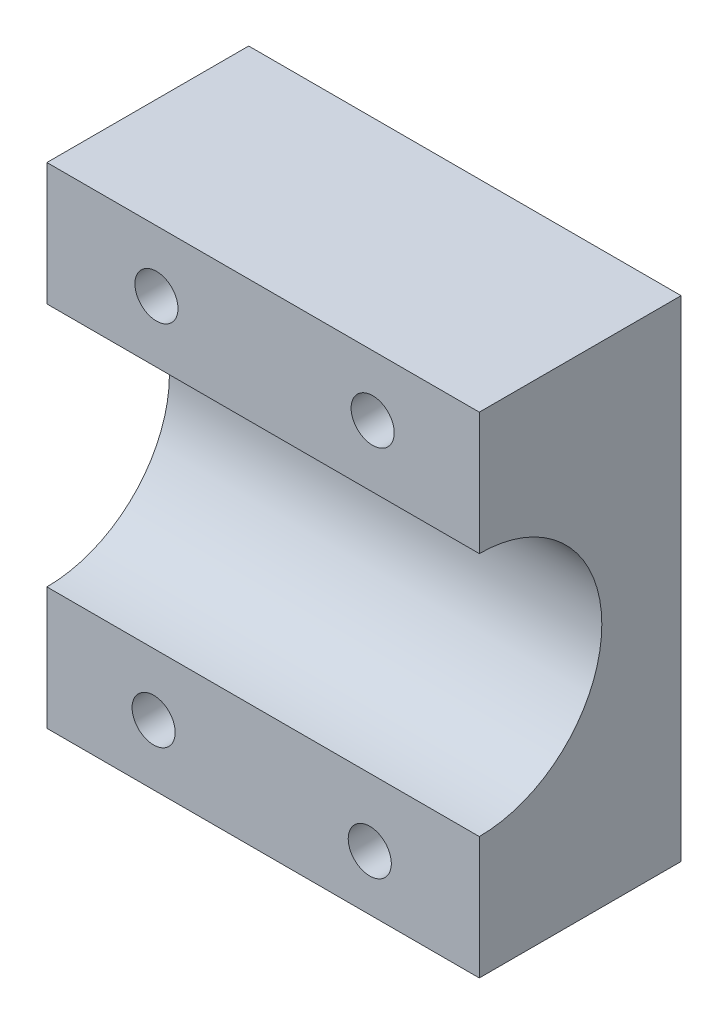
ISO-10303-21;
HEADER;
FILE_DESCRIPTION(('STEP AP214'),'2;1');
FILE_NAME('part.step','',(''),(''),'','','');
FILE_SCHEMA(('AUTOMOTIVE_DESIGN { 1 0 10303 214 1 1 1 1 }'));
ENDSEC;
DATA;
#1=APPLICATION_CONTEXT('core data for automotive mechanical design processes');
#2=APPLICATION_PROTOCOL_DEFINITION('international standard','automotive_design',2000,#1);
#3=PRODUCT_CONTEXT('',#1,'mechanical');
#4=PRODUCT('Part','Part','',(#3));
#5=PRODUCT_RELATED_PRODUCT_CATEGORY('part','',(#4));
#6=PRODUCT_DEFINITION_FORMATION('','',#4);
#7=PRODUCT_DEFINITION_CONTEXT('part definition',#1,'design');
#8=PRODUCT_DEFINITION('design','',#6,#7);
#9=PRODUCT_DEFINITION_SHAPE('','',#8);
#10=(LENGTH_UNIT() NAMED_UNIT(*) SI_UNIT(.MILLI.,.METRE.));
#11=(NAMED_UNIT(*) PLANE_ANGLE_UNIT() SI_UNIT($,.RADIAN.));
#12=(NAMED_UNIT(*) SI_UNIT($,.STERADIAN.) SOLID_ANGLE_UNIT());
#13=UNCERTAINTY_MEASURE_WITH_UNIT(LENGTH_MEASURE(1.E-05),#10,'distance_accuracy_value','');
#14=(GEOMETRIC_REPRESENTATION_CONTEXT(3) GLOBAL_UNCERTAINTY_ASSIGNED_CONTEXT((#13)) GLOBAL_UNIT_ASSIGNED_CONTEXT((#10,
#11,#12)) REPRESENTATION_CONTEXT('',''));
#15=CARTESIAN_POINT('',(0.,0.,0.));
#16=DIRECTION('',(0.,0.,1.));
#17=DIRECTION('',(1.,0.,0.));
#18=AXIS2_PLACEMENT_3D('',#15,#16,#17);
#19=CARTESIAN_POINT('',(0.,0.,17.78));
#20=DIRECTION('',(0.,0.,-1.));
#21=DIRECTION('',(-1.,0.,0.));
#22=AXIS2_PLACEMENT_3D('',#19,#20,#21);
#23=PLANE('',#22);
#24=CARTESIAN_POINT('',(28.448,4.85506064015712,17.78));
#25=DIRECTION('',(0.,0.,-1.));
#26=DIRECTION('',(-1.,0.,0.));
#27=AXIS2_PLACEMENT_3D('',#24,#25,#26);
#28=CIRCLE('',#27,1.89864999999999);
#29=CARTESIAN_POINT('',(26.54935,4.85506064015712,17.78));
#30=VERTEX_POINT('',#29);
#31=EDGE_CURVE('E185',#30,#30,#28,.T.);
#32=ORIENTED_EDGE('',*,*,#31,.T.);
#33=EDGE_LOOP('',(#32));
#34=FACE_BOUND('',#33,.T.);
#35=CARTESIAN_POINT('',(9.4040215004954,5.334,17.78));
#36=DIRECTION('',(0.,0.,-1.));
#37=DIRECTION('',(-1.,0.,0.));
#38=AXIS2_PLACEMENT_3D('',#35,#36,#37);
#39=CIRCLE('',#38,1.89864999999999);
#40=CARTESIAN_POINT('',(7.50537150049541,5.334,17.78));
#41=VERTEX_POINT('',#40);
#42=EDGE_CURVE('E102',#41,#41,#39,.T.);
#43=ORIENTED_EDGE('',*,*,#42,.T.);
#44=EDGE_LOOP('',(#43));
#45=FACE_BOUND('',#44,.T.);
#46=DIRECTION('',(0.,1.,0.));
#47=VECTOR('',#46,1.);
#48=CARTESIAN_POINT('',(38.1,0.,17.78));
#49=LINE('',#48,#47);
#50=CARTESIAN_POINT('',(38.1,0.,17.78));
#51=VERTEX_POINT('',#50);
#52=CARTESIAN_POINT('',(38.1,10.795,17.78));
#53=VERTEX_POINT('',#52);
#54=EDGE_CURVE('E111',#51,#53,#49,.T.);
#55=ORIENTED_EDGE('',*,*,#54,.T.);
#56=DIRECTION('',(-1.,0.,0.));
#57=VECTOR('',#56,1.);
#58=CARTESIAN_POINT('',(38.1,10.795,17.78));
#59=LINE('',#58,#57);
#60=CARTESIAN_POINT('',(0.,10.795,17.78));
#61=VERTEX_POINT('',#60);
#62=EDGE_CURVE('E11',#53,#61,#59,.T.);
#63=ORIENTED_EDGE('',*,*,#62,.T.);
#64=DIRECTION('',(0.,-1.,0.));
#65=VECTOR('',#64,1.);
#66=CARTESIAN_POINT('',(0.,0.,17.78));
#67=LINE('',#66,#65);
#68=CARTESIAN_POINT('',(0.,0.,17.78));
#69=VERTEX_POINT('',#68);
#70=EDGE_CURVE('E85',#61,#69,#67,.T.);
#71=ORIENTED_EDGE('',*,*,#70,.T.);
#72=DIRECTION('',(1.,0.,0.));
#73=VECTOR('',#72,1.);
#74=CARTESIAN_POINT('',(0.,0.,17.78));
#75=LINE('',#74,#73);
#76=EDGE_CURVE('E105',#69,#51,#75,.T.);
#77=ORIENTED_EDGE('',*,*,#76,.T.);
#78=EDGE_LOOP('',(#55,#63,#71,#77));
#79=FACE_BOUND('',#78,.T.);
#80=ADVANCED_FACE('F33',(#34,#45,#79),#23,.F.);
#81=CARTESIAN_POINT('',(0.,0.,17.78));
#82=DIRECTION('',(1.,0.,0.));
#83=DIRECTION('',(0.,0.,-1.));
#84=AXIS2_PLACEMENT_3D('',#81,#82,#83);
#85=PLANE('',#84);
#86=ORIENTED_EDGE('',*,*,#70,.F.);
#87=CARTESIAN_POINT('',(0.,21.59,17.78));
#88=DIRECTION('',(-1.,0.,0.));
#89=DIRECTION('',(0.,0.,1.));
#90=AXIS2_PLACEMENT_3D('',#87,#88,#89);
#91=CIRCLE('',#90,10.795);
#92=CARTESIAN_POINT('',(0.,32.385,17.78));
#93=VERTEX_POINT('',#92);
#94=EDGE_CURVE('E95',#93,#61,#91,.T.);
#95=ORIENTED_EDGE('',*,*,#94,.F.);
#96=CARTESIAN_POINT('',(0.,43.18,17.78));
#97=VERTEX_POINT('',#96);
#98=EDGE_CURVE('E100',#97,#93,#67,.T.);
#99=ORIENTED_EDGE('',*,*,#98,.F.);
#100=DIRECTION('',(0.,0.,-1.));
#101=VECTOR('',#100,1.);
#102=CARTESIAN_POINT('',(0.,43.18,17.78));
#103=LINE('',#102,#101);
#104=CARTESIAN_POINT('',(0.,43.18,0.));
#105=VERTEX_POINT('',#104);
#106=EDGE_CURVE('E115',#97,#105,#103,.T.);
#107=ORIENTED_EDGE('',*,*,#106,.T.);
#108=DIRECTION('',(0.,-1.,0.));
#109=VECTOR('',#108,1.);
#110=CARTESIAN_POINT('',(0.,0.,0.));
#111=LINE('',#110,#109);
#112=CARTESIAN_POINT('',(0.,0.,0.));
#113=VERTEX_POINT('',#112);
#114=EDGE_CURVE('E116',#105,#113,#111,.T.);
#115=ORIENTED_EDGE('',*,*,#114,.T.);
#116=DIRECTION('',(0.,0.,-1.));
#117=VECTOR('',#116,1.);
#118=CARTESIAN_POINT('',(0.,0.,17.78));
#119=LINE('',#118,#117);
#120=EDGE_CURVE('E97',#69,#113,#119,.T.);
#121=ORIENTED_EDGE('',*,*,#120,.F.);
#122=EDGE_LOOP('',(#86,#95,#99,#107,#115,#121));
#123=FACE_BOUND('',#122,.T.);
#124=ADVANCED_FACE('F35',(#123),#85,.F.);
#125=CARTESIAN_POINT('',(0.,0.,17.78));
#126=DIRECTION('',(0.,1.,0.));
#127=DIRECTION('',(0.,0.,1.));
#128=AXIS2_PLACEMENT_3D('',#125,#126,#127);
#129=PLANE('',#128);
#130=DIRECTION('',(1.,0.,0.));
#131=VECTOR('',#130,1.);
#132=CARTESIAN_POINT('',(0.,0.,0.));
#133=LINE('',#132,#131);
#134=CARTESIAN_POINT('',(38.1,0.,0.));
#135=VERTEX_POINT('',#134);
#136=EDGE_CURVE('E119',#113,#135,#133,.T.);
#137=ORIENTED_EDGE('',*,*,#136,.T.);
#138=DIRECTION('',(0.,0.,-1.));
#139=VECTOR('',#138,1.);
#140=CARTESIAN_POINT('',(38.1,0.,17.78));
#141=LINE('',#140,#139);
#142=EDGE_CURVE('E127',#51,#135,#141,.T.);
#143=ORIENTED_EDGE('',*,*,#142,.F.);
#144=ORIENTED_EDGE('',*,*,#76,.F.);
#145=ORIENTED_EDGE('',*,*,#120,.T.);
#146=EDGE_LOOP('',(#137,#143,#144,#145));
#147=FACE_BOUND('',#146,.T.);
#148=ADVANCED_FACE('F132',(#147),#129,.F.);
#149=CARTESIAN_POINT('',(38.1,0.,17.78));
#150=DIRECTION('',(-1.,0.,0.));
#151=DIRECTION('',(0.,0.,1.));
#152=AXIS2_PLACEMENT_3D('',#149,#150,#151);
#153=PLANE('',#152);
#154=CARTESIAN_POINT('',(38.1,32.385,17.78));
#155=VERTEX_POINT('',#154);
#156=CARTESIAN_POINT('',(38.1,43.18,17.78));
#157=VERTEX_POINT('',#156);
#158=EDGE_CURVE('E107',#155,#157,#49,.T.);
#159=ORIENTED_EDGE('',*,*,#158,.F.);
#160=CARTESIAN_POINT('',(38.1,21.59,17.78));
#161=DIRECTION('',(-1.,0.,0.));
#162=DIRECTION('',(0.,0.,1.));
#163=AXIS2_PLACEMENT_3D('',#160,#161,#162);
#164=CIRCLE('',#163,10.795);
#165=EDGE_CURVE('E48',#155,#53,#164,.T.);
#166=ORIENTED_EDGE('',*,*,#165,.T.);
#167=ORIENTED_EDGE('',*,*,#54,.F.);
#168=ORIENTED_EDGE('',*,*,#142,.T.);
#169=DIRECTION('',(0.,1.,0.));
#170=VECTOR('',#169,1.);
#171=CARTESIAN_POINT('',(38.1,0.,0.));
#172=LINE('',#171,#170);
#173=CARTESIAN_POINT('',(38.1,43.18,0.));
#174=VERTEX_POINT('',#173);
#175=EDGE_CURVE('E121',#135,#174,#172,.T.);
#176=ORIENTED_EDGE('',*,*,#175,.T.);
#177=DIRECTION('',(0.,0.,-1.));
#178=VECTOR('',#177,1.);
#179=CARTESIAN_POINT('',(38.1,43.18,17.78));
#180=LINE('',#179,#178);
#181=EDGE_CURVE('E125',#157,#174,#180,.T.);
#182=ORIENTED_EDGE('',*,*,#181,.F.);
#183=EDGE_LOOP('',(#159,#166,#167,#168,#176,#182));
#184=FACE_BOUND('',#183,.T.);
#185=ADVANCED_FACE('F140',(#184),#153,.F.);
#186=CARTESIAN_POINT('',(0.,43.18,17.78));
#187=DIRECTION('',(0.,-1.,0.));
#188=DIRECTION('',(0.,0.,-1.));
#189=AXIS2_PLACEMENT_3D('',#186,#187,#188);
#190=PLANE('',#189);
#191=DIRECTION('',(-1.,0.,0.));
#192=VECTOR('',#191,1.);
#193=CARTESIAN_POINT('',(0.,43.18,0.));
#194=LINE('',#193,#192);
#195=EDGE_CURVE('E78',#174,#105,#194,.T.);
#196=ORIENTED_EDGE('',*,*,#195,.T.);
#197=ORIENTED_EDGE('',*,*,#106,.F.);
#198=DIRECTION('',(-1.,0.,0.));
#199=VECTOR('',#198,1.);
#200=CARTESIAN_POINT('',(0.,43.18,17.78));
#201=LINE('',#200,#199);
#202=EDGE_CURVE('E57',#157,#97,#201,.T.);
#203=ORIENTED_EDGE('',*,*,#202,.F.);
#204=ORIENTED_EDGE('',*,*,#181,.T.);
#205=EDGE_LOOP('',(#196,#197,#203,#204));
#206=FACE_BOUND('',#205,.T.);
#207=ADVANCED_FACE('F142',(#206),#190,.F.);
#208=CARTESIAN_POINT('',(28.7019564091041,37.846,17.78));
#209=DIRECTION('',(0.,0.,-1.));
#210=DIRECTION('',(-1.,0.,0.));
#211=AXIS2_PLACEMENT_3D('',#208,#209,#210);
#212=CIRCLE('',#211,1.89864999999999);
#213=CARTESIAN_POINT('',(26.8033064091041,37.846,17.78));
#214=VERTEX_POINT('',#213);
#215=EDGE_CURVE('E262',#214,#214,#212,.T.);
#216=ORIENTED_EDGE('',*,*,#215,.T.);
#217=EDGE_LOOP('',(#216));
#218=FACE_BOUND('',#217,.T.);
#219=CARTESIAN_POINT('',(9.652,37.8052469481856,17.78));
#220=DIRECTION('',(0.,0.,-1.));
#221=DIRECTION('',(-1.,0.,0.));
#222=AXIS2_PLACEMENT_3D('',#219,#220,#221);
#223=CIRCLE('',#222,1.89864999999999);
#224=CARTESIAN_POINT('',(7.75335,37.8052469481856,17.78));
#225=VERTEX_POINT('',#224);
#226=EDGE_CURVE('E272',#225,#225,#223,.T.);
#227=ORIENTED_EDGE('',*,*,#226,.T.);
#228=EDGE_LOOP('',(#227));
#229=FACE_BOUND('',#228,.T.);
#230=ORIENTED_EDGE('',*,*,#98,.T.);
#231=DIRECTION('',(-1.,0.,0.));
#232=VECTOR('',#231,1.);
#233=CARTESIAN_POINT('',(38.1,32.385,17.78));
#234=LINE('',#233,#232);
#235=EDGE_CURVE('E41',#93,#155,#234,.F.);
#236=ORIENTED_EDGE('',*,*,#235,.T.);
#237=ORIENTED_EDGE('',*,*,#158,.T.);
#238=ORIENTED_EDGE('',*,*,#202,.T.);
#239=EDGE_LOOP('',(#230,#236,#237,#238));
#240=FACE_BOUND('',#239,.T.);
#241=ADVANCED_FACE('F104',(#218,#229,#240),#23,.F.);
#242=CARTESIAN_POINT('',(0.,0.,0.));
#243=DIRECTION('',(0.,0.,-1.));
#244=DIRECTION('',(-1.,0.,0.));
#245=AXIS2_PLACEMENT_3D('',#242,#243,#244);
#246=PLANE('',#245);
#247=CARTESIAN_POINT('',(28.7019564091041,37.846,0.));
#248=DIRECTION('',(0.,0.,-1.));
#249=DIRECTION('',(-1.,0.,0.));
#250=AXIS2_PLACEMENT_3D('',#247,#248,#249);
#251=CIRCLE('',#250,3.96874999999999);
#252=CARTESIAN_POINT('',(24.7332064091041,37.846,0.));
#253=VERTEX_POINT('',#252);
#254=EDGE_CURVE('E171',#253,#253,#251,.T.);
#255=ORIENTED_EDGE('',*,*,#254,.F.);
#256=EDGE_LOOP('',(#255));
#257=FACE_BOUND('',#256,.T.);
#258=CARTESIAN_POINT('',(9.652,37.8052469481856,0.));
#259=DIRECTION('',(0.,0.,-1.));
#260=DIRECTION('',(-1.,0.,0.));
#261=AXIS2_PLACEMENT_3D('',#258,#259,#260);
#262=CIRCLE('',#261,3.96875);
#263=CARTESIAN_POINT('',(5.68325,37.8052469481856,0.));
#264=VERTEX_POINT('',#263);
#265=EDGE_CURVE('E175',#264,#264,#262,.T.);
#266=ORIENTED_EDGE('',*,*,#265,.F.);
#267=EDGE_LOOP('',(#266));
#268=FACE_BOUND('',#267,.T.);
#269=CARTESIAN_POINT('',(28.448,4.85506064015712,0.));
#270=DIRECTION('',(0.,0.,-1.));
#271=DIRECTION('',(-1.,0.,0.));
#272=AXIS2_PLACEMENT_3D('',#269,#270,#271);
#273=CIRCLE('',#272,3.96874999999999);
#274=CARTESIAN_POINT('',(24.47925,4.85506064015712,0.));
#275=VERTEX_POINT('',#274);
#276=EDGE_CURVE('E179',#275,#275,#273,.T.);
#277=ORIENTED_EDGE('',*,*,#276,.F.);
#278=EDGE_LOOP('',(#277));
#279=FACE_BOUND('',#278,.T.);
#280=CARTESIAN_POINT('',(9.4040215004954,5.334,0.));
#281=DIRECTION('',(0.,0.,-1.));
#282=DIRECTION('',(-1.,0.,0.));
#283=AXIS2_PLACEMENT_3D('',#280,#281,#282);
#284=CIRCLE('',#283,3.96875);
#285=CARTESIAN_POINT('',(5.43527150049541,5.334,0.));
#286=VERTEX_POINT('',#285);
#287=EDGE_CURVE('E182',#286,#286,#284,.T.);
#288=ORIENTED_EDGE('',*,*,#287,.F.);
#289=EDGE_LOOP('',(#288));
#290=FACE_BOUND('',#289,.T.);
#291=ORIENTED_EDGE('',*,*,#114,.F.);
#292=ORIENTED_EDGE('',*,*,#195,.F.);
#293=ORIENTED_EDGE('',*,*,#175,.F.);
#294=ORIENTED_EDGE('',*,*,#136,.F.);
#295=EDGE_LOOP('',(#291,#292,#293,#294));
#296=FACE_BOUND('',#295,.T.);
#297=ADVANCED_FACE('F136',(#257,#268,#279,#290,#296),#246,.T.);
#298=CARTESIAN_POINT('',(38.1,21.59,17.78));
#299=DIRECTION('',(-1.,0.,0.));
#300=DIRECTION('',(0.,0.,1.));
#301=AXIS2_PLACEMENT_3D('',#298,#299,#300);
#302=CYLINDRICAL_SURFACE('',#301,10.795);
#303=ORIENTED_EDGE('',*,*,#165,.F.);
#304=ORIENTED_EDGE('',*,*,#235,.F.);
#305=ORIENTED_EDGE('',*,*,#94,.T.);
#306=ORIENTED_EDGE('',*,*,#62,.F.);
#307=EDGE_LOOP('',(#303,#304,#305,#306));
#308=FACE_BOUND('',#307,.T.);
#309=ADVANCED_FACE('F94',(#308),#302,.F.);
#310=CARTESIAN_POINT('',(9.4040215004954,5.334,0.));
#311=DIRECTION('',(0.,0.,-1.));
#312=DIRECTION('',(-1.,0.,0.));
#313=AXIS2_PLACEMENT_3D('',#310,#311,#312);
#314=CYLINDRICAL_SURFACE('',#313,1.89865);
#315=ORIENTED_EDGE('',*,*,#42,.F.);
#316=EDGE_LOOP('',(#315));
#317=FACE_BOUND('',#316,.T.);
#318=CARTESIAN_POINT('',(9.4040215004954,5.334,2.2098));
#319=DIRECTION('',(0.,0.,-1.));
#320=DIRECTION('',(-1.,0.,0.));
#321=AXIS2_PLACEMENT_3D('',#318,#319,#320);
#322=CIRCLE('',#321,1.89865);
#323=CARTESIAN_POINT('',(7.5053715004954,5.334,2.2098));
#324=VERTEX_POINT('',#323);
#325=EDGE_CURVE('E188',#324,#324,#322,.T.);
#326=ORIENTED_EDGE('',*,*,#325,.T.);
#327=EDGE_LOOP('',(#326));
#328=FACE_BOUND('',#327,.T.);
#329=ADVANCED_FACE('F167',(#317,#328),#314,.F.);
#330=CARTESIAN_POINT('',(11.3026715004954,5.334,2.2098));
#331=DIRECTION('',(0.,0.,1.));
#332=DIRECTION('',(1.,0.,0.));
#333=AXIS2_PLACEMENT_3D('',#330,#331,#332);
#334=PLANE('',#333);
#335=ORIENTED_EDGE('',*,*,#325,.F.);
#336=EDGE_LOOP('',(#335));
#337=FACE_BOUND('',#336,.T.);
#338=CARTESIAN_POINT('',(9.4040215004954,5.334,2.2098));
#339=DIRECTION('',(0.,0.,-1.));
#340=DIRECTION('',(-1.,0.,0.));
#341=AXIS2_PLACEMENT_3D('',#338,#339,#340);
#342=CIRCLE('',#341,3.96875);
#343=CARTESIAN_POINT('',(5.43527150049541,5.334,2.2098));
#344=VERTEX_POINT('',#343);
#345=EDGE_CURVE('E184',#344,#344,#342,.T.);
#346=ORIENTED_EDGE('',*,*,#345,.T.);
#347=EDGE_LOOP('',(#346));
#348=FACE_BOUND('',#347,.T.);
#349=ADVANCED_FACE('F201',(#337,#348),#334,.F.);
#350=CARTESIAN_POINT('',(9.4040215004954,5.334,0.));
#351=DIRECTION('',(0.,0.,-1.));
#352=DIRECTION('',(-1.,0.,0.));
#353=AXIS2_PLACEMENT_3D('',#350,#351,#352);
#354=CYLINDRICAL_SURFACE('',#353,3.96875);
#355=ORIENTED_EDGE('',*,*,#345,.F.);
#356=EDGE_LOOP('',(#355));
#357=FACE_BOUND('',#356,.T.);
#358=ORIENTED_EDGE('',*,*,#287,.T.);
#359=EDGE_LOOP('',(#358));
#360=FACE_BOUND('',#359,.T.);
#361=ADVANCED_FACE('F206',(#357,#360),#354,.F.);
#362=CARTESIAN_POINT('',(28.448,4.85506064015712,0.));
#363=DIRECTION('',(0.,0.,-1.));
#364=DIRECTION('',(-1.,0.,0.));
#365=AXIS2_PLACEMENT_3D('',#362,#363,#364);
#366=CYLINDRICAL_SURFACE('',#365,1.89865);
#367=ORIENTED_EDGE('',*,*,#31,.F.);
#368=EDGE_LOOP('',(#367));
#369=FACE_BOUND('',#368,.T.);
#370=CARTESIAN_POINT('',(28.448,4.85506064015712,2.2098));
#371=DIRECTION('',(0.,0.,-1.));
#372=DIRECTION('',(-1.,0.,0.));
#373=AXIS2_PLACEMENT_3D('',#370,#371,#372);
#374=CIRCLE('',#373,1.89865);
#375=CARTESIAN_POINT('',(26.54935,4.85506064015712,2.2098));
#376=VERTEX_POINT('',#375);
#377=EDGE_CURVE('E190',#376,#376,#374,.T.);
#378=ORIENTED_EDGE('',*,*,#377,.T.);
#379=EDGE_LOOP('',(#378));
#380=FACE_BOUND('',#379,.T.);
#381=ADVANCED_FACE('F211',(#369,#380),#366,.F.);
#382=CARTESIAN_POINT('',(30.34665,4.85506064015712,2.2098));
#383=DIRECTION('',(0.,0.,1.));
#384=DIRECTION('',(1.,0.,0.));
#385=AXIS2_PLACEMENT_3D('',#382,#383,#384);
#386=PLANE('',#385);
#387=ORIENTED_EDGE('',*,*,#377,.F.);
#388=EDGE_LOOP('',(#387));
#389=FACE_BOUND('',#388,.T.);
#390=CARTESIAN_POINT('',(28.448,4.85506064015712,2.2098));
#391=DIRECTION('',(0.,0.,-1.));
#392=DIRECTION('',(-1.,0.,0.));
#393=AXIS2_PLACEMENT_3D('',#390,#391,#392);
#394=CIRCLE('',#393,3.96874999999999);
#395=CARTESIAN_POINT('',(24.47925,4.85506064015712,2.2098));
#396=VERTEX_POINT('',#395);
#397=EDGE_CURVE('E276',#396,#396,#394,.T.);
#398=ORIENTED_EDGE('',*,*,#397,.T.);
#399=EDGE_LOOP('',(#398));
#400=FACE_BOUND('',#399,.T.);
#401=ADVANCED_FACE('F216',(#389,#400),#386,.F.);
#402=CARTESIAN_POINT('',(28.448,4.85506064015712,0.));
#403=DIRECTION('',(0.,0.,-1.));
#404=DIRECTION('',(-1.,0.,0.));
#405=AXIS2_PLACEMENT_3D('',#402,#403,#404);
#406=CYLINDRICAL_SURFACE('',#405,3.96874999999999);
#407=ORIENTED_EDGE('',*,*,#397,.F.);
#408=EDGE_LOOP('',(#407));
#409=FACE_BOUND('',#408,.T.);
#410=ORIENTED_EDGE('',*,*,#276,.T.);
#411=EDGE_LOOP('',(#410));
#412=FACE_BOUND('',#411,.T.);
#413=ADVANCED_FACE('F222',(#409,#412),#406,.F.);
#414=CARTESIAN_POINT('',(9.652,37.8052469481856,0.));
#415=DIRECTION('',(0.,0.,-1.));
#416=DIRECTION('',(-1.,0.,0.));
#417=AXIS2_PLACEMENT_3D('',#414,#415,#416);
#418=CYLINDRICAL_SURFACE('',#417,1.89865);
#419=ORIENTED_EDGE('',*,*,#226,.F.);
#420=EDGE_LOOP('',(#419));
#421=FACE_BOUND('',#420,.T.);
#422=CARTESIAN_POINT('',(9.652,37.8052469481856,2.2098));
#423=DIRECTION('',(0.,0.,-1.));
#424=DIRECTION('',(-1.,0.,0.));
#425=AXIS2_PLACEMENT_3D('',#422,#423,#424);
#426=CIRCLE('',#425,1.89865);
#427=CARTESIAN_POINT('',(7.75335,37.8052469481856,2.2098));
#428=VERTEX_POINT('',#427);
#429=EDGE_CURVE('E269',#428,#428,#426,.T.);
#430=ORIENTED_EDGE('',*,*,#429,.T.);
#431=EDGE_LOOP('',(#430));
#432=FACE_BOUND('',#431,.T.);
#433=ADVANCED_FACE('F226',(#421,#432),#418,.F.);
#434=CARTESIAN_POINT('',(11.55065,37.8052469481856,2.2098));
#435=DIRECTION('',(0.,0.,1.));
#436=DIRECTION('',(1.,0.,0.));
#437=AXIS2_PLACEMENT_3D('',#434,#435,#436);
#438=PLANE('',#437);
#439=ORIENTED_EDGE('',*,*,#429,.F.);
#440=EDGE_LOOP('',(#439));
#441=FACE_BOUND('',#440,.T.);
#442=CARTESIAN_POINT('',(9.652,37.8052469481856,2.2098));
#443=DIRECTION('',(0.,0.,-1.));
#444=DIRECTION('',(-1.,0.,0.));
#445=AXIS2_PLACEMENT_3D('',#442,#443,#444);
#446=CIRCLE('',#445,3.96875);
#447=CARTESIAN_POINT('',(5.68325,37.8052469481856,2.2098));
#448=VERTEX_POINT('',#447);
#449=EDGE_CURVE('E266',#448,#448,#446,.T.);
#450=ORIENTED_EDGE('',*,*,#449,.T.);
#451=EDGE_LOOP('',(#450));
#452=FACE_BOUND('',#451,.T.);
#453=ADVANCED_FACE('F230',(#441,#452),#438,.F.);
#454=CARTESIAN_POINT('',(9.652,37.8052469481856,0.));
#455=DIRECTION('',(0.,0.,-1.));
#456=DIRECTION('',(-1.,0.,0.));
#457=AXIS2_PLACEMENT_3D('',#454,#455,#456);
#458=CYLINDRICAL_SURFACE('',#457,3.96875);
#459=ORIENTED_EDGE('',*,*,#449,.F.);
#460=EDGE_LOOP('',(#459));
#461=FACE_BOUND('',#460,.T.);
#462=ORIENTED_EDGE('',*,*,#265,.T.);
#463=EDGE_LOOP('',(#462));
#464=FACE_BOUND('',#463,.T.);
#465=ADVANCED_FACE('F234',(#461,#464),#458,.F.);
#466=CARTESIAN_POINT('',(28.7019564091041,37.846,0.));
#467=DIRECTION('',(0.,0.,-1.));
#468=DIRECTION('',(-1.,0.,0.));
#469=AXIS2_PLACEMENT_3D('',#466,#467,#468);
#470=CYLINDRICAL_SURFACE('',#469,1.89865);
#471=ORIENTED_EDGE('',*,*,#215,.F.);
#472=EDGE_LOOP('',(#471));
#473=FACE_BOUND('',#472,.T.);
#474=CARTESIAN_POINT('',(28.7019564091041,37.846,2.2098));
#475=DIRECTION('',(0.,0.,-1.));
#476=DIRECTION('',(-1.,0.,0.));
#477=AXIS2_PLACEMENT_3D('',#474,#475,#476);
#478=CIRCLE('',#477,1.89865);
#479=CARTESIAN_POINT('',(26.8033064091041,37.846,2.2098));
#480=VERTEX_POINT('',#479);
#481=EDGE_CURVE('E257',#480,#480,#478,.T.);
#482=ORIENTED_EDGE('',*,*,#481,.T.);
#483=EDGE_LOOP('',(#482));
#484=FACE_BOUND('',#483,.T.);
#485=ADVANCED_FACE('F238',(#473,#484),#470,.F.);
#486=CARTESIAN_POINT('',(30.6006064091041,37.846,2.2098));
#487=DIRECTION('',(0.,0.,1.));
#488=DIRECTION('',(1.,0.,0.));
#489=AXIS2_PLACEMENT_3D('',#486,#487,#488);
#490=PLANE('',#489);
#491=ORIENTED_EDGE('',*,*,#481,.F.);
#492=EDGE_LOOP('',(#491));
#493=FACE_BOUND('',#492,.T.);
#494=CARTESIAN_POINT('',(28.7019564091041,37.846,2.2098));
#495=DIRECTION('',(0.,0.,-1.));
#496=DIRECTION('',(-1.,0.,0.));
#497=AXIS2_PLACEMENT_3D('',#494,#495,#496);
#498=CIRCLE('',#497,3.96874999999999);
#499=CARTESIAN_POINT('',(24.7332064091041,37.846,2.2098));
#500=VERTEX_POINT('',#499);
#501=EDGE_CURVE('E255',#500,#500,#498,.T.);
#502=ORIENTED_EDGE('',*,*,#501,.T.);
#503=EDGE_LOOP('',(#502));
#504=FACE_BOUND('',#503,.T.);
#505=ADVANCED_FACE('F242',(#493,#504),#490,.F.);
#506=CARTESIAN_POINT('',(28.7019564091041,37.846,0.));
#507=DIRECTION('',(0.,0.,-1.));
#508=DIRECTION('',(-1.,0.,0.));
#509=AXIS2_PLACEMENT_3D('',#506,#507,#508);
#510=CYLINDRICAL_SURFACE('',#509,3.96874999999999);
#511=ORIENTED_EDGE('',*,*,#501,.F.);
#512=EDGE_LOOP('',(#511));
#513=FACE_BOUND('',#512,.T.);
#514=ORIENTED_EDGE('',*,*,#254,.T.);
#515=EDGE_LOOP('',(#514));
#516=FACE_BOUND('',#515,.T.);
#517=ADVANCED_FACE('F246',(#513,#516),#510,.F.);
#518=CLOSED_SHELL('',(#80,#124,#148,#185,#207,#241,#297,#309,#329,#349,#361,#381,#401,#413,#433,
#453,#465,#485,#505,#517));
#519=MANIFOLD_SOLID_BREP('B2',#518);
#520=ADVANCED_BREP_SHAPE_REPRESENTATION('',(#18,#519),#14);
#521=SHAPE_DEFINITION_REPRESENTATION(#9,#520);
ENDSEC;
END-ISO-10303-21;
